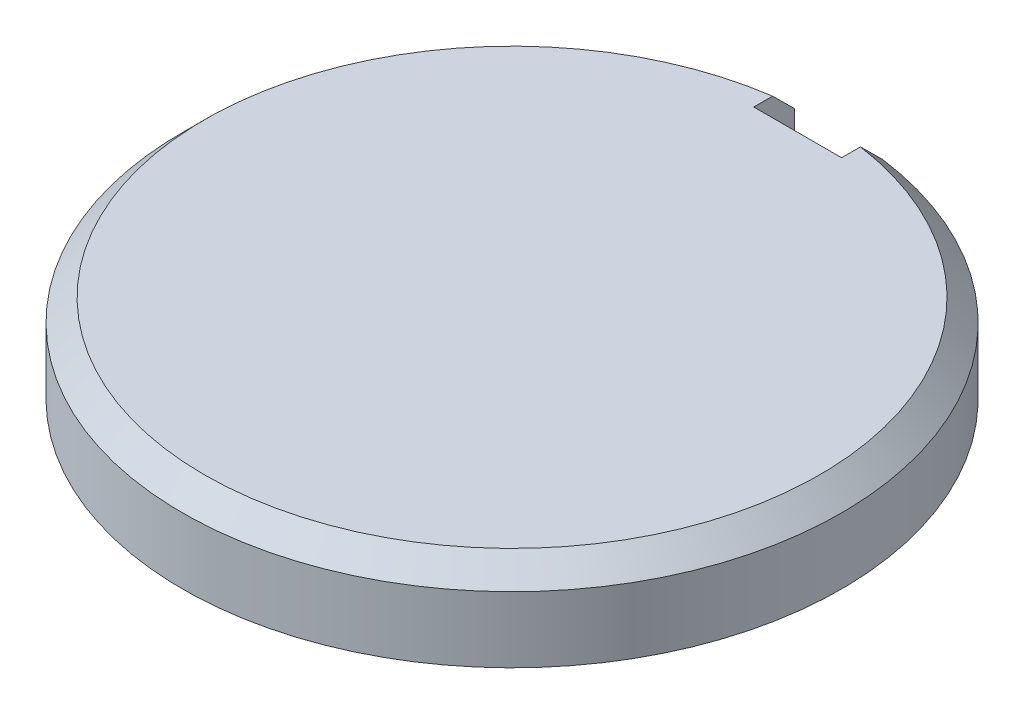
ISO-10303-21;
HEADER;
FILE_DESCRIPTION(('STEP AP214'),'2;1');
FILE_NAME('part.step','',(''),(''),'','','');
FILE_SCHEMA(('AUTOMOTIVE_DESIGN { 1 0 10303 214 1 1 1 1 }'));
ENDSEC;
DATA;
#1=APPLICATION_CONTEXT('core data for automotive mechanical design processes');
#2=APPLICATION_PROTOCOL_DEFINITION('international standard','automotive_design',2000,#1);
#3=PRODUCT_CONTEXT('',#1,'mechanical');
#4=PRODUCT('Part','Part','',(#3));
#5=PRODUCT_RELATED_PRODUCT_CATEGORY('part','',(#4));
#6=PRODUCT_DEFINITION_FORMATION('','',#4);
#7=PRODUCT_DEFINITION_CONTEXT('part definition',#1,'design');
#8=PRODUCT_DEFINITION('design','',#6,#7);
#9=PRODUCT_DEFINITION_SHAPE('','',#8);
#10=(LENGTH_UNIT() NAMED_UNIT(*) SI_UNIT(.MILLI.,.METRE.));
#11=(NAMED_UNIT(*) PLANE_ANGLE_UNIT() SI_UNIT($,.RADIAN.));
#12=(NAMED_UNIT(*) SI_UNIT($,.STERADIAN.) SOLID_ANGLE_UNIT());
#13=UNCERTAINTY_MEASURE_WITH_UNIT(LENGTH_MEASURE(1.E-05),#10,'distance_accuracy_value','');
#14=(GEOMETRIC_REPRESENTATION_CONTEXT(3) GLOBAL_UNCERTAINTY_ASSIGNED_CONTEXT((#13)) GLOBAL_UNIT_ASSIGNED_CONTEXT((#10,
#11,#12)) REPRESENTATION_CONTEXT('',''));
#15=CARTESIAN_POINT('',(0.,0.,0.));
#16=DIRECTION('',(0.,0.,1.));
#17=DIRECTION('',(1.,0.,0.));
#18=AXIS2_PLACEMENT_3D('',#15,#16,#17);
#19=CARTESIAN_POINT('',(0.,52.2,-62.));
#20=DIRECTION('',(0.,1.,0.));
#21=DIRECTION('',(0.,0.,1.));
#22=AXIS2_PLACEMENT_3D('',#19,#20,#21);
#23=PLANE('',#22);
#24=DIRECTION('',(-1.,0.,0.));
#25=VECTOR('',#24,1.);
#26=CARTESIAN_POINT('',(0.,52.2,-67.2));
#27=LINE('',#26,#25);
#28=CARTESIAN_POINT('',(0.8,52.2,-67.2));
#29=VERTEX_POINT('',#28);
#30=CARTESIAN_POINT('',(-0.8,52.2,-67.2));
#31=VERTEX_POINT('',#30);
#32=EDGE_CURVE('E204',#29,#31,#27,.T.);
#33=ORIENTED_EDGE('',*,*,#32,.T.);
#34=DIRECTION('',(0.,0.,-1.));
#35=VECTOR('',#34,1.);
#36=CARTESIAN_POINT('',(-0.8,52.2,-62.));
#37=LINE('',#36,#35);
#38=CARTESIAN_POINT('',(-0.8,52.2,-67.5425625842204));
#39=VERTEX_POINT('',#38);
#40=EDGE_CURVE('E191',#31,#39,#37,.T.);
#41=ORIENTED_EDGE('',*,*,#40,.T.);
#42=CARTESIAN_POINT('',(0.,52.2,-62.));
#43=DIRECTION('',(0.,-1.,0.));
#44=DIRECTION('',(0.,0.,-1.));
#45=AXIS2_PLACEMENT_3D('',#42,#43,#44);
#46=CIRCLE('',#45,5.6);
#47=CARTESIAN_POINT('',(0.8,52.2,-67.5425625842204));
#48=VERTEX_POINT('',#47);
#49=EDGE_CURVE('E355',#48,#39,#46,.T.);
#50=ORIENTED_EDGE('',*,*,#49,.F.);
#51=DIRECTION('',(0.,0.,1.));
#52=VECTOR('',#51,1.);
#53=CARTESIAN_POINT('',(0.8,52.2,-62.));
#54=LINE('',#53,#52);
#55=EDGE_CURVE('E210',#48,#29,#54,.T.);
#56=ORIENTED_EDGE('',*,*,#55,.T.);
#57=EDGE_LOOP('',(#33,#41,#50,#56));
#58=FACE_BOUND('',#57,.T.);
#59=ADVANCED_FACE('F47',(#58),#23,.T.);
#60=CARTESIAN_POINT('',(0.,51.8,-62.));
#61=DIRECTION('',(0.,-1.,0.));
#62=DIRECTION('',(0.,0.,-1.));
#63=AXIS2_PLACEMENT_3D('',#60,#61,#62);
#64=CONICAL_SURFACE('',#63,6.,0.785398163397452);
#65=ORIENTED_EDGE('',*,*,#49,.T.);
#66=CARTESIAN_POINT('',(-0.8,53.0946271909999,-66.6368667515551));
#67=CARTESIAN_POINT('',(-0.8,52.9126166868986,-66.8215553370668));
#68=CARTESIAN_POINT('',(-0.8,52.7304582431577,-67.0060979425622));
#69=CARTESIAN_POINT('',(-0.8,52.3659108831408,-67.374955064313));
#70=CARTESIAN_POINT('',(-0.8,52.1835219670777,-67.5592695807787));
#71=CARTESIAN_POINT('',(-0.8,51.8185788185969,-67.9277346494659));
#72=CARTESIAN_POINT('',(-0.8,51.6360245862569,-68.1118852017641));
#73=CARTESIAN_POINT('',(-0.8,51.2707866928955,-68.4800582504329));
#74=CARTESIAN_POINT('',(-0.8,51.0881030317565,-68.6640807466868));
#75=CARTESIAN_POINT('',(-0.8,50.9053728090001,-68.8480569582091));
#76=B_SPLINE_CURVE_WITH_KNOTS('',3,(#66,#67,#68,#69,#70,#71,#72,#73,#74,#75),.UNSPECIFIED.,.F.,
.F.,(4,2,2,2,4),(0.,0.777906711944224,1.55581270618922,2.33371833583191,3.11162467374074),.UNSPECIFIED.);
#77=CARTESIAN_POINT('',(-0.8,51.8,-67.9464274989274));
#78=VERTEX_POINT('',#77);
#79=EDGE_CURVE('E196',#39,#78,#76,.T.);
#80=ORIENTED_EDGE('',*,*,#79,.T.);
#81=CARTESIAN_POINT('',(0.,51.8,-62.));
#82=DIRECTION('',(0.,-1.,0.));
#83=DIRECTION('',(0.,0.,-1.));
#84=AXIS2_PLACEMENT_3D('',#81,#82,#83);
#85=CIRCLE('',#84,6.);
#86=CARTESIAN_POINT('',(0.8,51.8,-67.9464274989274));
#87=VERTEX_POINT('',#86);
#88=EDGE_CURVE('E351',#87,#78,#85,.T.);
#89=ORIENTED_EDGE('',*,*,#88,.F.);
#90=CARTESIAN_POINT('',(0.8,50.9053728090001,-68.8480569582091));
#91=CARTESIAN_POINT('',(0.8,51.0881030317565,-68.6640807466868));
#92=CARTESIAN_POINT('',(0.8,51.2707866928955,-68.4800582504329));
#93=CARTESIAN_POINT('',(0.8,51.6360245862569,-68.1118852017641));
#94=CARTESIAN_POINT('',(0.8,51.8185788185969,-67.9277346494659));
#95=CARTESIAN_POINT('',(0.8,52.1835219670777,-67.5592695807787));
#96=CARTESIAN_POINT('',(0.8,52.3659108831408,-67.374955064313));
#97=CARTESIAN_POINT('',(0.8,52.7304582431577,-67.0060979425621));
#98=CARTESIAN_POINT('',(0.8,52.9126166868986,-66.8215553370668));
#99=CARTESIAN_POINT('',(0.8,53.0946271909999,-66.6368667515551));
#100=B_SPLINE_CURVE_WITH_KNOTS('',3,(#90,#91,#92,#93,#94,#95,#96,#97,#98,#99),.UNSPECIFIED.,.F.,
.F.,(4,2,2,2,4),(0.,0.777906337908827,1.55581196755152,2.33371796179654,3.11162467374074),.UNSPECIFIED.);
#101=EDGE_CURVE('E217',#87,#48,#100,.T.);
#102=ORIENTED_EDGE('',*,*,#101,.T.);
#103=EDGE_LOOP('',(#65,#80,#89,#102));
#104=FACE_BOUND('',#103,.T.);
#105=ADVANCED_FACE('F231',(#104),#64,.T.);
#106=CARTESIAN_POINT('',(0.,44.6,-62.));
#107=DIRECTION('',(0.,-1.,0.));
#108=DIRECTION('',(0.,0.,-1.));
#109=AXIS2_PLACEMENT_3D('',#106,#107,#108);
#110=CYLINDRICAL_SURFACE('',#109,6.);
#111=ORIENTED_EDGE('',*,*,#88,.T.);
#112=DIRECTION('',(0.,-1.,0.));
#113=VECTOR('',#112,1.);
#114=CARTESIAN_POINT('',(-0.8,44.6,-67.9464274989274));
#115=LINE('',#114,#113);
#116=CARTESIAN_POINT('',(-0.8,50.6,-67.9464274989274));
#117=VERTEX_POINT('',#116);
#118=EDGE_CURVE('E253',#78,#117,#115,.T.);
#119=ORIENTED_EDGE('',*,*,#118,.T.);
#120=CARTESIAN_POINT('',(0.,50.6,-62.));
#121=DIRECTION('',(0.,-1.,0.));
#122=DIRECTION('',(0.,0.,-1.));
#123=AXIS2_PLACEMENT_3D('',#120,#121,#122);
#124=CIRCLE('',#123,6.);
#125=CARTESIAN_POINT('',(0.8,50.6,-67.9464274989274));
#126=VERTEX_POINT('',#125);
#127=EDGE_CURVE('E347',#126,#117,#124,.T.);
#128=ORIENTED_EDGE('',*,*,#127,.F.);
#129=DIRECTION('',(0.,-1.,0.));
#130=VECTOR('',#129,1.);
#131=CARTESIAN_POINT('',(0.8,44.6,-67.9464274989274));
#132=LINE('',#131,#130);
#133=EDGE_CURVE('E212',#126,#87,#132,.F.);
#134=ORIENTED_EDGE('',*,*,#133,.T.);
#135=EDGE_LOOP('',(#111,#119,#128,#134));
#136=FACE_BOUND('',#135,.T.);
#137=ADVANCED_FACE('F417',(#136),#110,.T.);
#138=CARTESIAN_POINT('',(6.,50.6,-62.));
#139=DIRECTION('',(0.,-1.,0.));
#140=DIRECTION('',(0.,0.,-1.));
#141=AXIS2_PLACEMENT_3D('',#138,#139,#140);
#142=PLANE('',#141);
#143=CARTESIAN_POINT('',(0.,50.6,-62.));
#144=DIRECTION('',(0.,-1.,0.));
#145=DIRECTION('',(0.,0.,-1.));
#146=AXIS2_PLACEMENT_3D('',#143,#144,#145);
#147=CIRCLE('',#146,3.);
#148=CARTESIAN_POINT('',(0.,50.6,-65.));
#149=VERTEX_POINT('',#148);
#150=EDGE_CURVE('E341',#149,#149,#147,.T.);
#151=ORIENTED_EDGE('',*,*,#150,.F.);
#152=EDGE_LOOP('',(#151));
#153=FACE_BOUND('',#152,.T.);
#154=ORIENTED_EDGE('',*,*,#127,.T.);
#155=DIRECTION('',(0.,0.,1.));
#156=VECTOR('',#155,1.);
#157=CARTESIAN_POINT('',(-0.8,50.6,-62.));
#158=LINE('',#157,#156);
#159=CARTESIAN_POINT('',(-0.8,50.6,-67.2));
#160=VERTEX_POINT('',#159);
#161=EDGE_CURVE('E11',#117,#160,#158,.T.);
#162=ORIENTED_EDGE('',*,*,#161,.T.);
#163=DIRECTION('',(1.,0.,0.));
#164=VECTOR('',#163,1.);
#165=CARTESIAN_POINT('',(6.,50.6,-67.2));
#166=LINE('',#165,#164);
#167=CARTESIAN_POINT('',(0.8,50.6,-67.2));
#168=VERTEX_POINT('',#167);
#169=EDGE_CURVE('E206',#160,#168,#166,.T.);
#170=ORIENTED_EDGE('',*,*,#169,.T.);
#171=DIRECTION('',(0.,0.,-1.));
#172=VECTOR('',#171,1.);
#173=CARTESIAN_POINT('',(0.8,50.6,-62.));
#174=LINE('',#173,#172);
#175=EDGE_CURVE('E56',#168,#126,#174,.T.);
#176=ORIENTED_EDGE('',*,*,#175,.T.);
#177=EDGE_LOOP('',(#154,#162,#170,#176));
#178=FACE_BOUND('',#177,.T.);
#179=ADVANCED_FACE('F414',(#153,#178),#142,.T.);
#180=CARTESIAN_POINT('',(3.,49.6,-62.));
#181=DIRECTION('',(0.,-1.,0.));
#182=DIRECTION('',(0.,0.,-1.));
#183=AXIS2_PLACEMENT_3D('',#180,#181,#182);
#184=PLANE('',#183);
#185=CARTESIAN_POINT('',(0.,49.6,-62.));
#186=DIRECTION('',(0.,-1.,0.));
#187=DIRECTION('',(0.,0.,-1.));
#188=AXIS2_PLACEMENT_3D('',#185,#186,#187);
#189=CIRCLE('',#188,3.);
#190=CARTESIAN_POINT('',(-0.4,49.6,-59.0267862505363));
#191=VERTEX_POINT('',#190);
#192=CARTESIAN_POINT('',(-2.9732137494637,49.6,-61.6));
#193=VERTEX_POINT('',#192);
#194=EDGE_CURVE('E343',#191,#193,#189,.T.);
#195=ORIENTED_EDGE('',*,*,#194,.T.);
#196=DIRECTION('',(1.,0.,0.));
#197=VECTOR('',#196,1.);
#198=CARTESIAN_POINT('',(3.,49.6,-61.6));
#199=LINE('',#198,#197);
#200=CARTESIAN_POINT('',(-2.26495033058123,49.6,-61.6));
#201=VERTEX_POINT('',#200);
#202=EDGE_CURVE('E275',#193,#201,#199,.T.);
#203=ORIENTED_EDGE('',*,*,#202,.T.);
#204=CARTESIAN_POINT('',(0.,49.6,-62.));
#205=DIRECTION('',(0.,-1.,0.));
#206=DIRECTION('',(0.,0.,-1.));
#207=AXIS2_PLACEMENT_3D('',#204,#205,#206);
#208=CIRCLE('',#207,2.3);
#209=CARTESIAN_POINT('',(-0.4,49.6,-59.7350496694188));
#210=VERTEX_POINT('',#209);
#211=EDGE_CURVE('E369',#210,#201,#208,.T.);
#212=ORIENTED_EDGE('',*,*,#211,.F.);
#213=DIRECTION('',(0.,0.,1.));
#214=VECTOR('',#213,1.);
#215=CARTESIAN_POINT('',(-0.4,49.6,-62.));
#216=LINE('',#215,#214);
#217=EDGE_CURVE('E328',#210,#191,#216,.T.);
#218=ORIENTED_EDGE('',*,*,#217,.T.);
#219=EDGE_LOOP('',(#195,#203,#212,#218));
#220=FACE_BOUND('',#219,.T.);
#221=ADVANCED_FACE('F479',(#220),#184,.T.);
#222=CARTESIAN_POINT('',(2.26495033058123,49.6,-61.6));
#223=VERTEX_POINT('',#222);
#224=CARTESIAN_POINT('',(0.4,49.6,-59.7350496694188));
#225=VERTEX_POINT('',#224);
#226=EDGE_CURVE('E368',#223,#225,#208,.T.);
#227=ORIENTED_EDGE('',*,*,#226,.F.);
#228=DIRECTION('',(1.,0.,0.));
#229=VECTOR('',#228,1.);
#230=CARTESIAN_POINT('',(3.,49.6,-61.6));
#231=LINE('',#230,#229);
#232=CARTESIAN_POINT('',(2.9732137494637,49.6,-61.6));
#233=VERTEX_POINT('',#232);
#234=EDGE_CURVE('E283',#223,#233,#231,.T.);
#235=ORIENTED_EDGE('',*,*,#234,.T.);
#236=CARTESIAN_POINT('',(0.4,49.6,-59.0267862505363));
#237=VERTEX_POINT('',#236);
#238=EDGE_CURVE('E342',#233,#237,#189,.T.);
#239=ORIENTED_EDGE('',*,*,#238,.T.);
#240=DIRECTION('',(0.,0.,-1.));
#241=VECTOR('',#240,1.);
#242=CARTESIAN_POINT('',(0.4,49.6,-62.));
#243=LINE('',#242,#241);
#244=EDGE_CURVE('E310',#237,#225,#243,.T.);
#245=ORIENTED_EDGE('',*,*,#244,.T.);
#246=EDGE_LOOP('',(#227,#235,#239,#245));
#247=FACE_BOUND('',#246,.T.);
#248=ADVANCED_FACE('F466',(#247),#184,.T.);
#249=CARTESIAN_POINT('',(0.,44.6,-62.));
#250=DIRECTION('',(0.,-1.,0.));
#251=DIRECTION('',(0.,0.,-1.));
#252=AXIS2_PLACEMENT_3D('',#249,#250,#251);
#253=CYLINDRICAL_SURFACE('',#252,2.3);
#254=CARTESIAN_POINT('',(0.,50.6,-62.));
#255=DIRECTION('',(0.,-1.,0.));
#256=DIRECTION('',(0.,0.,-1.));
#257=AXIS2_PLACEMENT_3D('',#254,#255,#256);
#258=CIRCLE('',#257,2.3);
#259=CARTESIAN_POINT('',(0.,50.6,-64.3));
#260=VERTEX_POINT('',#259);
#261=EDGE_CURVE('E358',#260,#260,#258,.T.);
#262=ORIENTED_EDGE('',*,*,#261,.F.);
#263=EDGE_LOOP('',(#262));
#264=FACE_BOUND('',#263,.T.);
#265=CARTESIAN_POINT('',(0.,50.58,-62.));
#266=DIRECTION('',(0.,-1.,0.));
#267=DIRECTION('',(0.,0.,-1.));
#268=AXIS2_PLACEMENT_3D('',#265,#266,#267);
#269=CIRCLE('',#268,2.3);
#270=CARTESIAN_POINT('',(2.26495033058123,50.58,-62.4));
#271=VERTEX_POINT('',#270);
#272=CARTESIAN_POINT('',(2.26495033058123,50.58,-61.6));
#273=VERTEX_POINT('',#272);
#274=EDGE_CURVE('E295',#271,#273,#269,.T.);
#275=ORIENTED_EDGE('',*,*,#274,.T.);
#276=DIRECTION('',(0.,-1.,0.));
#277=VECTOR('',#276,1.);
#278=CARTESIAN_POINT('',(2.26495033058123,44.6,-61.6));
#279=LINE('',#278,#277);
#280=EDGE_CURVE('E287',#273,#223,#279,.T.);
#281=ORIENTED_EDGE('',*,*,#280,.T.);
#282=ORIENTED_EDGE('',*,*,#226,.T.);
#283=DIRECTION('',(0.,-1.,0.));
#284=VECTOR('',#283,1.);
#285=CARTESIAN_POINT('',(0.4,44.6,-59.7350496694188));
#286=LINE('',#285,#284);
#287=CARTESIAN_POINT('',(0.4,50.58,-59.7350496694188));
#288=VERTEX_POINT('',#287);
#289=EDGE_CURVE('E314',#225,#288,#286,.F.);
#290=ORIENTED_EDGE('',*,*,#289,.T.);
#291=CARTESIAN_POINT('',(0.,50.58,-62.));
#292=DIRECTION('',(0.,-1.,0.));
#293=DIRECTION('',(0.,0.,-1.));
#294=AXIS2_PLACEMENT_3D('',#291,#292,#293);
#295=CIRCLE('',#294,2.3);
#296=CARTESIAN_POINT('',(-0.4,50.58,-59.7350496694188));
#297=VERTEX_POINT('',#296);
#298=EDGE_CURVE('E309',#288,#297,#295,.T.);
#299=ORIENTED_EDGE('',*,*,#298,.T.);
#300=DIRECTION('',(0.,-1.,0.));
#301=VECTOR('',#300,1.);
#302=CARTESIAN_POINT('',(-0.4,44.6,-59.7350496694188));
#303=LINE('',#302,#301);
#304=EDGE_CURVE('E332',#297,#210,#303,.T.);
#305=ORIENTED_EDGE('',*,*,#304,.T.);
#306=ORIENTED_EDGE('',*,*,#211,.T.);
#307=DIRECTION('',(0.,-1.,0.));
#308=VECTOR('',#307,1.);
#309=CARTESIAN_POINT('',(-2.26495033058123,44.6,-61.6));
#310=LINE('',#309,#308);
#311=CARTESIAN_POINT('',(-2.26495033058123,50.58,-61.6));
#312=VERTEX_POINT('',#311);
#313=EDGE_CURVE('E279',#201,#312,#310,.F.);
#314=ORIENTED_EDGE('',*,*,#313,.T.);
#315=CARTESIAN_POINT('',(-2.26495033058123,50.58,-62.4));
#316=VERTEX_POINT('',#315);
#317=EDGE_CURVE('E291',#312,#316,#269,.T.);
#318=ORIENTED_EDGE('',*,*,#317,.T.);
#319=DIRECTION('',(0.,-1.,0.));
#320=VECTOR('',#319,1.);
#321=CARTESIAN_POINT('',(-2.26495033058123,44.6,-62.4));
#322=LINE('',#321,#320);
#323=CARTESIAN_POINT('',(-2.26495033058123,49.6,-62.4));
#324=VERTEX_POINT('',#323);
#325=EDGE_CURVE('E266',#324,#316,#322,.F.);
#326=ORIENTED_EDGE('',*,*,#325,.F.);
#327=CARTESIAN_POINT('',(-0.4,49.6,-64.2649503305812));
#328=VERTEX_POINT('',#327);
#329=EDGE_CURVE('E362',#324,#328,#208,.T.);
#330=ORIENTED_EDGE('',*,*,#329,.T.);
#331=DIRECTION('',(0.,-1.,0.));
#332=VECTOR('',#331,1.);
#333=CARTESIAN_POINT('',(-0.4,44.6,-64.2649503305812));
#334=LINE('',#333,#332);
#335=CARTESIAN_POINT('',(-0.4,50.58,-64.2649503305812));
#336=VERTEX_POINT('',#335);
#337=EDGE_CURVE('E327',#328,#336,#334,.F.);
#338=ORIENTED_EDGE('',*,*,#337,.T.);
#339=CARTESIAN_POINT('',(0.4,50.58,-64.2649503305812));
#340=VERTEX_POINT('',#339);
#341=EDGE_CURVE('E305',#336,#340,#295,.T.);
#342=ORIENTED_EDGE('',*,*,#341,.T.);
#343=DIRECTION('',(0.,-1.,0.));
#344=VECTOR('',#343,1.);
#345=CARTESIAN_POINT('',(0.4,44.6,-64.2649503305812));
#346=LINE('',#345,#344);
#347=CARTESIAN_POINT('',(0.4,49.6,-64.2649503305812));
#348=VERTEX_POINT('',#347);
#349=EDGE_CURVE('E319',#340,#348,#346,.T.);
#350=ORIENTED_EDGE('',*,*,#349,.T.);
#351=CARTESIAN_POINT('',(2.26495033058123,49.6,-62.4));
#352=VERTEX_POINT('',#351);
#353=EDGE_CURVE('E363',#348,#352,#208,.T.);
#354=ORIENTED_EDGE('',*,*,#353,.T.);
#355=DIRECTION('',(0.,-1.,0.));
#356=VECTOR('',#355,1.);
#357=CARTESIAN_POINT('',(2.26495033058123,44.6,-62.4));
#358=LINE('',#357,#356);
#359=EDGE_CURVE('E272',#271,#352,#358,.T.);
#360=ORIENTED_EDGE('',*,*,#359,.F.);
#361=EDGE_LOOP('',(#275,#281,#282,#290,#299,#305,#306,#314,#318,#326,#330,#338,#342,#350,#354,#360));
#362=FACE_BOUND('',#361,.T.);
#363=ADVANCED_FACE('F462',(#264,#362),#253,.F.);
#364=CARTESIAN_POINT('',(0.,44.6,-62.));
#365=DIRECTION('',(0.,-1.,0.));
#366=DIRECTION('',(0.,0.,-1.));
#367=AXIS2_PLACEMENT_3D('',#364,#365,#366);
#368=CYLINDRICAL_SURFACE('',#367,3.);
#369=ORIENTED_EDGE('',*,*,#150,.T.);
#370=EDGE_LOOP('',(#369));
#371=FACE_BOUND('',#370,.T.);
#372=ORIENTED_EDGE('',*,*,#238,.F.);
#373=DIRECTION('',(0.,-1.,0.));
#374=VECTOR('',#373,1.);
#375=CARTESIAN_POINT('',(2.9732137494637,44.6,-61.6));
#376=LINE('',#375,#374);
#377=CARTESIAN_POINT('',(2.9732137494637,50.58,-61.6));
#378=VERTEX_POINT('',#377);
#379=EDGE_CURVE('E405',#233,#378,#376,.F.);
#380=ORIENTED_EDGE('',*,*,#379,.T.);
#381=CARTESIAN_POINT('',(0.,50.58,-62.));
#382=DIRECTION('',(0.,-1.,0.));
#383=DIRECTION('',(0.,0.,-1.));
#384=AXIS2_PLACEMENT_3D('',#381,#382,#383);
#385=CIRCLE('',#384,3.);
#386=CARTESIAN_POINT('',(2.9732137494637,50.58,-62.4));
#387=VERTEX_POINT('',#386);
#388=EDGE_CURVE('E398',#378,#387,#385,.F.);
#389=ORIENTED_EDGE('',*,*,#388,.T.);
#390=DIRECTION('',(0.,-1.,0.));
#391=VECTOR('',#390,1.);
#392=CARTESIAN_POINT('',(2.9732137494637,44.6,-62.4));
#393=LINE('',#392,#391);
#394=CARTESIAN_POINT('',(2.9732137494637,49.6,-62.4));
#395=VERTEX_POINT('',#394);
#396=EDGE_CURVE('E402',#395,#387,#393,.F.);
#397=ORIENTED_EDGE('',*,*,#396,.F.);
#398=CARTESIAN_POINT('',(0.4,49.6,-64.9732137494637));
#399=VERTEX_POINT('',#398);
#400=EDGE_CURVE('E337',#399,#395,#189,.T.);
#401=ORIENTED_EDGE('',*,*,#400,.F.);
#402=DIRECTION('',(0.,-1.,0.));
#403=VECTOR('',#402,1.);
#404=CARTESIAN_POINT('',(0.4,44.6,-64.9732137494637));
#405=LINE('',#404,#403);
#406=CARTESIAN_POINT('',(0.4,50.58,-64.9732137494637));
#407=VERTEX_POINT('',#406);
#408=EDGE_CURVE('E373',#399,#407,#405,.F.);
#409=ORIENTED_EDGE('',*,*,#408,.T.);
#410=CARTESIAN_POINT('',(0.,50.58,-62.));
#411=DIRECTION('',(0.,-1.,0.));
#412=DIRECTION('',(0.,0.,-1.));
#413=AXIS2_PLACEMENT_3D('',#410,#411,#412);
#414=CIRCLE('',#413,3.);
#415=CARTESIAN_POINT('',(-0.4,50.58,-64.9732137494637));
#416=VERTEX_POINT('',#415);
#417=EDGE_CURVE('E367',#407,#416,#414,.F.);
#418=ORIENTED_EDGE('',*,*,#417,.T.);
#419=DIRECTION('',(0.,-1.,0.));
#420=VECTOR('',#419,1.);
#421=CARTESIAN_POINT('',(-0.4,44.6,-64.9732137494637));
#422=LINE('',#421,#420);
#423=CARTESIAN_POINT('',(-0.4,49.6,-64.9732137494637));
#424=VERTEX_POINT('',#423);
#425=EDGE_CURVE('E378',#416,#424,#422,.T.);
#426=ORIENTED_EDGE('',*,*,#425,.T.);
#427=CARTESIAN_POINT('',(-2.9732137494637,49.6,-62.4));
#428=VERTEX_POINT('',#427);
#429=EDGE_CURVE('E336',#428,#424,#189,.T.);
#430=ORIENTED_EDGE('',*,*,#429,.F.);
#431=DIRECTION('',(0.,-1.,0.));
#432=VECTOR('',#431,1.);
#433=CARTESIAN_POINT('',(-2.9732137494637,44.6,-62.4));
#434=LINE('',#433,#432);
#435=CARTESIAN_POINT('',(-2.9732137494637,50.58,-62.4));
#436=VERTEX_POINT('',#435);
#437=EDGE_CURVE('E390',#436,#428,#434,.T.);
#438=ORIENTED_EDGE('',*,*,#437,.F.);
#439=CARTESIAN_POINT('',(-2.9732137494637,50.58,-61.6));
#440=VERTEX_POINT('',#439);
#441=EDGE_CURVE('E393',#436,#440,#385,.F.);
#442=ORIENTED_EDGE('',*,*,#441,.T.);
#443=DIRECTION('',(0.,-1.,0.));
#444=VECTOR('',#443,1.);
#445=CARTESIAN_POINT('',(-2.9732137494637,44.6,-61.6));
#446=LINE('',#445,#444);
#447=EDGE_CURVE('E397',#440,#193,#446,.T.);
#448=ORIENTED_EDGE('',*,*,#447,.T.);
#449=ORIENTED_EDGE('',*,*,#194,.F.);
#450=DIRECTION('',(0.,-1.,0.));
#451=VECTOR('',#450,1.);
#452=CARTESIAN_POINT('',(-0.4,44.6,-59.0267862505363));
#453=LINE('',#452,#451);
#454=CARTESIAN_POINT('',(-0.4,50.58,-59.0267862505363));
#455=VERTEX_POINT('',#454);
#456=EDGE_CURVE('E386',#191,#455,#453,.F.);
#457=ORIENTED_EDGE('',*,*,#456,.T.);
#458=CARTESIAN_POINT('',(0.4,50.58,-59.0267862505363));
#459=VERTEX_POINT('',#458);
#460=EDGE_CURVE('E374',#455,#459,#414,.F.);
#461=ORIENTED_EDGE('',*,*,#460,.T.);
#462=DIRECTION('',(0.,-1.,0.));
#463=VECTOR('',#462,1.);
#464=CARTESIAN_POINT('',(0.4,44.6,-59.0267862505363));
#465=LINE('',#464,#463);
#466=EDGE_CURVE('E382',#459,#237,#465,.T.);
#467=ORIENTED_EDGE('',*,*,#466,.T.);
#468=EDGE_LOOP('',(#372,#380,#389,#397,#401,#409,#418,#426,#430,#438,#442,#448,#449,#457,#461,#467));
#469=FACE_BOUND('',#468,.T.);
#470=ADVANCED_FACE('F452',(#371,#469),#368,.T.);
#471=DIRECTION('',(1.,0.,0.));
#472=VECTOR('',#471,1.);
#473=CARTESIAN_POINT('',(3.,49.6,-62.4));
#474=LINE('',#473,#472);
#475=EDGE_CURVE('E263',#428,#324,#474,.T.);
#476=ORIENTED_EDGE('',*,*,#475,.F.);
#477=ORIENTED_EDGE('',*,*,#429,.T.);
#478=EDGE_CURVE('E323',#424,#328,#216,.T.);
#479=ORIENTED_EDGE('',*,*,#478,.T.);
#480=ORIENTED_EDGE('',*,*,#329,.F.);
#481=EDGE_LOOP('',(#476,#477,#479,#480));
#482=FACE_BOUND('',#481,.T.);
#483=ADVANCED_FACE('F49',(#482),#184,.T.);
#484=DIRECTION('',(1.,0.,0.));
#485=VECTOR('',#484,1.);
#486=CARTESIAN_POINT('',(3.,49.6,-62.4));
#487=LINE('',#486,#485);
#488=EDGE_CURVE('E269',#352,#395,#487,.T.);
#489=ORIENTED_EDGE('',*,*,#488,.F.);
#490=ORIENTED_EDGE('',*,*,#353,.F.);
#491=EDGE_CURVE('E315',#348,#399,#243,.T.);
#492=ORIENTED_EDGE('',*,*,#491,.T.);
#493=ORIENTED_EDGE('',*,*,#400,.T.);
#494=EDGE_LOOP('',(#489,#490,#492,#493));
#495=FACE_BOUND('',#494,.T.);
#496=ADVANCED_FACE('F504',(#495),#184,.T.);
#497=CARTESIAN_POINT('',(2.3,50.6,-62.));
#498=DIRECTION('',(0.,-1.,0.));
#499=DIRECTION('',(0.,0.,-1.));
#500=AXIS2_PLACEMENT_3D('',#497,#498,#499);
#501=PLANE('',#500);
#502=ORIENTED_EDGE('',*,*,#261,.T.);
#503=EDGE_LOOP('',(#502));
#504=FACE_BOUND('',#503,.T.);
#505=ADVANCED_FACE('F520',(#504),#501,.T.);
#506=CARTESIAN_POINT('',(-0.4,50.58,-58.8));
#507=DIRECTION('',(0.,-1.,0.));
#508=DIRECTION('',(0.,0.,-1.));
#509=AXIS2_PLACEMENT_3D('',#506,#507,#508);
#510=PLANE('',#509);
#511=DIRECTION('',(0.,0.,-1.));
#512=VECTOR('',#511,1.);
#513=CARTESIAN_POINT('',(-0.4,50.58,-58.8));
#514=LINE('',#513,#512);
#515=EDGE_CURVE('E296',#336,#416,#514,.T.);
#516=ORIENTED_EDGE('',*,*,#515,.T.);
#517=ORIENTED_EDGE('',*,*,#417,.F.);
#518=DIRECTION('',(0.,0.,-1.));
#519=VECTOR('',#518,1.);
#520=CARTESIAN_POINT('',(0.4,50.58,-58.8));
#521=LINE('',#520,#519);
#522=EDGE_CURVE('E300',#340,#407,#521,.T.);
#523=ORIENTED_EDGE('',*,*,#522,.F.);
#524=ORIENTED_EDGE('',*,*,#341,.F.);
#525=EDGE_LOOP('',(#516,#517,#523,#524));
#526=FACE_BOUND('',#525,.T.);
#527=ADVANCED_FACE('F498',(#526),#510,.T.);
#528=CARTESIAN_POINT('',(0.4,49.3,-58.8));
#529=DIRECTION('',(-1.,0.,0.));
#530=DIRECTION('',(0.,0.,1.));
#531=AXIS2_PLACEMENT_3D('',#528,#529,#530);
#532=PLANE('',#531);
#533=ORIENTED_EDGE('',*,*,#522,.T.);
#534=ORIENTED_EDGE('',*,*,#408,.F.);
#535=ORIENTED_EDGE('',*,*,#491,.F.);
#536=ORIENTED_EDGE('',*,*,#349,.F.);
#537=EDGE_LOOP('',(#533,#534,#535,#536));
#538=FACE_BOUND('',#537,.T.);
#539=ADVANCED_FACE('F500',(#538),#532,.T.);
#540=CARTESIAN_POINT('',(-0.4,49.3,-58.8));
#541=DIRECTION('',(1.,0.,0.));
#542=DIRECTION('',(0.,0.,-1.));
#543=AXIS2_PLACEMENT_3D('',#540,#541,#542);
#544=PLANE('',#543);
#545=ORIENTED_EDGE('',*,*,#478,.F.);
#546=ORIENTED_EDGE('',*,*,#425,.F.);
#547=ORIENTED_EDGE('',*,*,#515,.F.);
#548=ORIENTED_EDGE('',*,*,#337,.F.);
#549=EDGE_LOOP('',(#545,#546,#547,#548));
#550=FACE_BOUND('',#549,.T.);
#551=ADVANCED_FACE('F494',(#550),#544,.T.);
#552=EDGE_CURVE('E299',#455,#297,#514,.T.);
#553=ORIENTED_EDGE('',*,*,#552,.F.);
#554=ORIENTED_EDGE('',*,*,#456,.F.);
#555=ORIENTED_EDGE('',*,*,#217,.F.);
#556=ORIENTED_EDGE('',*,*,#304,.F.);
#557=EDGE_LOOP('',(#553,#554,#555,#556));
#558=FACE_BOUND('',#557,.T.);
#559=ADVANCED_FACE('F476',(#558),#544,.T.);
#560=EDGE_CURVE('E304',#459,#288,#521,.T.);
#561=ORIENTED_EDGE('',*,*,#560,.F.);
#562=ORIENTED_EDGE('',*,*,#460,.F.);
#563=ORIENTED_EDGE('',*,*,#552,.T.);
#564=ORIENTED_EDGE('',*,*,#298,.F.);
#565=EDGE_LOOP('',(#561,#562,#563,#564));
#566=FACE_BOUND('',#565,.T.);
#567=ADVANCED_FACE('F474',(#566),#510,.T.);
#568=ORIENTED_EDGE('',*,*,#244,.F.);
#569=ORIENTED_EDGE('',*,*,#466,.F.);
#570=ORIENTED_EDGE('',*,*,#560,.T.);
#571=ORIENTED_EDGE('',*,*,#289,.F.);
#572=EDGE_LOOP('',(#568,#569,#570,#571));
#573=FACE_BOUND('',#572,.T.);
#574=ADVANCED_FACE('F470',(#573),#532,.T.);
#575=CARTESIAN_POINT('',(0.,0.,-62.4));
#576=DIRECTION('',(0.,0.,-1.));
#577=DIRECTION('',(-1.,0.,0.));
#578=AXIS2_PLACEMENT_3D('',#575,#576,#577);
#579=PLANE('',#578);
#580=ORIENTED_EDGE('',*,*,#325,.T.);
#581=DIRECTION('',(-1.,0.,0.));
#582=VECTOR('',#581,1.);
#583=CARTESIAN_POINT('',(-3.2,50.58,-62.4));
#584=LINE('',#583,#582);
#585=EDGE_CURVE('E71',#316,#436,#584,.T.);
#586=ORIENTED_EDGE('',*,*,#585,.T.);
#587=ORIENTED_EDGE('',*,*,#437,.T.);
#588=ORIENTED_EDGE('',*,*,#475,.T.);
#589=EDGE_LOOP('',(#580,#586,#587,#588));
#590=FACE_BOUND('',#589,.T.);
#591=ADVANCED_FACE('F507',(#590),#579,.F.);
#592=CARTESIAN_POINT('',(0.,0.,-61.6));
#593=DIRECTION('',(0.,0.,-1.));
#594=DIRECTION('',(-1.,0.,0.));
#595=AXIS2_PLACEMENT_3D('',#592,#593,#594);
#596=PLANE('',#595);
#597=ORIENTED_EDGE('',*,*,#202,.F.);
#598=ORIENTED_EDGE('',*,*,#447,.F.);
#599=DIRECTION('',(-1.,0.,0.));
#600=VECTOR('',#599,1.);
#601=CARTESIAN_POINT('',(-3.2,50.58,-61.6));
#602=LINE('',#601,#600);
#603=EDGE_CURVE('E255',#312,#440,#602,.T.);
#604=ORIENTED_EDGE('',*,*,#603,.F.);
#605=ORIENTED_EDGE('',*,*,#313,.F.);
#606=EDGE_LOOP('',(#597,#598,#604,#605));
#607=FACE_BOUND('',#606,.T.);
#608=ADVANCED_FACE('F245',(#607),#596,.T.);
#609=CARTESIAN_POINT('',(-3.2,50.58,-61.6));
#610=DIRECTION('',(0.,-1.,0.));
#611=DIRECTION('',(0.,0.,-1.));
#612=AXIS2_PLACEMENT_3D('',#609,#610,#611);
#613=PLANE('',#612);
#614=ORIENTED_EDGE('',*,*,#603,.T.);
#615=ORIENTED_EDGE('',*,*,#441,.F.);
#616=ORIENTED_EDGE('',*,*,#585,.F.);
#617=ORIENTED_EDGE('',*,*,#317,.F.);
#618=EDGE_LOOP('',(#614,#615,#616,#617));
#619=FACE_BOUND('',#618,.T.);
#620=ADVANCED_FACE('F485',(#619),#613,.T.);
#621=EDGE_CURVE('E260',#387,#271,#584,.T.);
#622=ORIENTED_EDGE('',*,*,#621,.F.);
#623=ORIENTED_EDGE('',*,*,#388,.F.);
#624=EDGE_CURVE('E259',#378,#273,#602,.T.);
#625=ORIENTED_EDGE('',*,*,#624,.T.);
#626=ORIENTED_EDGE('',*,*,#274,.F.);
#627=EDGE_LOOP('',(#622,#623,#625,#626));
#628=FACE_BOUND('',#627,.T.);
#629=ADVANCED_FACE('F457',(#628),#613,.T.);
#630=ORIENTED_EDGE('',*,*,#624,.F.);
#631=ORIENTED_EDGE('',*,*,#379,.F.);
#632=ORIENTED_EDGE('',*,*,#234,.F.);
#633=ORIENTED_EDGE('',*,*,#280,.F.);
#634=EDGE_LOOP('',(#630,#631,#632,#633));
#635=FACE_BOUND('',#634,.T.);
#636=ADVANCED_FACE('F459',(#635),#596,.T.);
#637=ORIENTED_EDGE('',*,*,#359,.T.);
#638=ORIENTED_EDGE('',*,*,#488,.T.);
#639=ORIENTED_EDGE('',*,*,#396,.T.);
#640=ORIENTED_EDGE('',*,*,#621,.T.);
#641=EDGE_LOOP('',(#637,#638,#639,#640));
#642=FACE_BOUND('',#641,.T.);
#643=ADVANCED_FACE('F244',(#642),#579,.F.);
#644=CARTESIAN_POINT('',(-0.8,50.5,-67.2));
#645=DIRECTION('',(1.,0.,0.));
#646=DIRECTION('',(0.,0.,-1.));
#647=AXIS2_PLACEMENT_3D('',#644,#645,#646);
#648=PLANE('',#647);
#649=DIRECTION('',(0.,-1.,0.));
#650=VECTOR('',#649,1.);
#651=CARTESIAN_POINT('',(-0.8,50.5,-67.2));
#652=LINE('',#651,#650);
#653=EDGE_CURVE('E194',#31,#160,#652,.T.);
#654=ORIENTED_EDGE('',*,*,#653,.T.);
#655=ORIENTED_EDGE('',*,*,#161,.F.);
#656=ORIENTED_EDGE('',*,*,#118,.F.);
#657=ORIENTED_EDGE('',*,*,#79,.F.);
#658=ORIENTED_EDGE('',*,*,#40,.F.);
#659=EDGE_LOOP('',(#654,#655,#656,#657,#658));
#660=FACE_BOUND('',#659,.T.);
#661=ADVANCED_FACE('F193',(#660),#648,.T.);
#662=CARTESIAN_POINT('',(0.8,50.5,-67.2));
#663=DIRECTION('',(-1.,0.,0.));
#664=DIRECTION('',(0.,0.,1.));
#665=AXIS2_PLACEMENT_3D('',#662,#663,#664);
#666=PLANE('',#665);
#667=ORIENTED_EDGE('',*,*,#101,.F.);
#668=ORIENTED_EDGE('',*,*,#133,.F.);
#669=ORIENTED_EDGE('',*,*,#175,.F.);
#670=DIRECTION('',(0.,1.,0.));
#671=VECTOR('',#670,1.);
#672=CARTESIAN_POINT('',(0.8,50.5,-67.2));
#673=LINE('',#672,#671);
#674=EDGE_CURVE('E63',#168,#29,#673,.T.);
#675=ORIENTED_EDGE('',*,*,#674,.T.);
#676=ORIENTED_EDGE('',*,*,#55,.F.);
#677=EDGE_LOOP('',(#667,#668,#669,#675,#676));
#678=FACE_BOUND('',#677,.T.);
#679=ADVANCED_FACE('F235',(#678),#666,.T.);
#680=CARTESIAN_POINT('',(0.,0.,-67.2));
#681=DIRECTION('',(0.,0.,-1.));
#682=DIRECTION('',(-1.,0.,0.));
#683=AXIS2_PLACEMENT_3D('',#680,#681,#682);
#684=PLANE('',#683);
#685=ORIENTED_EDGE('',*,*,#674,.F.);
#686=ORIENTED_EDGE('',*,*,#169,.F.);
#687=ORIENTED_EDGE('',*,*,#653,.F.);
#688=ORIENTED_EDGE('',*,*,#32,.F.);
#689=EDGE_LOOP('',(#685,#686,#687,#688));
#690=FACE_BOUND('',#689,.T.);
#691=ADVANCED_FACE('F203',(#690),#684,.T.);
#692=CLOSED_SHELL('',(#59,#105,#137,#179,#221,#248,#363,#470,#483,#496,#505,#527,#539,#551,#559,
#567,#574,#591,#608,#620,#629,#636,#643,#661,#679,#691));
#693=MANIFOLD_SOLID_BREP('B2',#692);
#694=ADVANCED_BREP_SHAPE_REPRESENTATION('',(#18,#693),#14);
#695=SHAPE_DEFINITION_REPRESENTATION(#9,#694);
ENDSEC;
END-ISO-10303-21;
